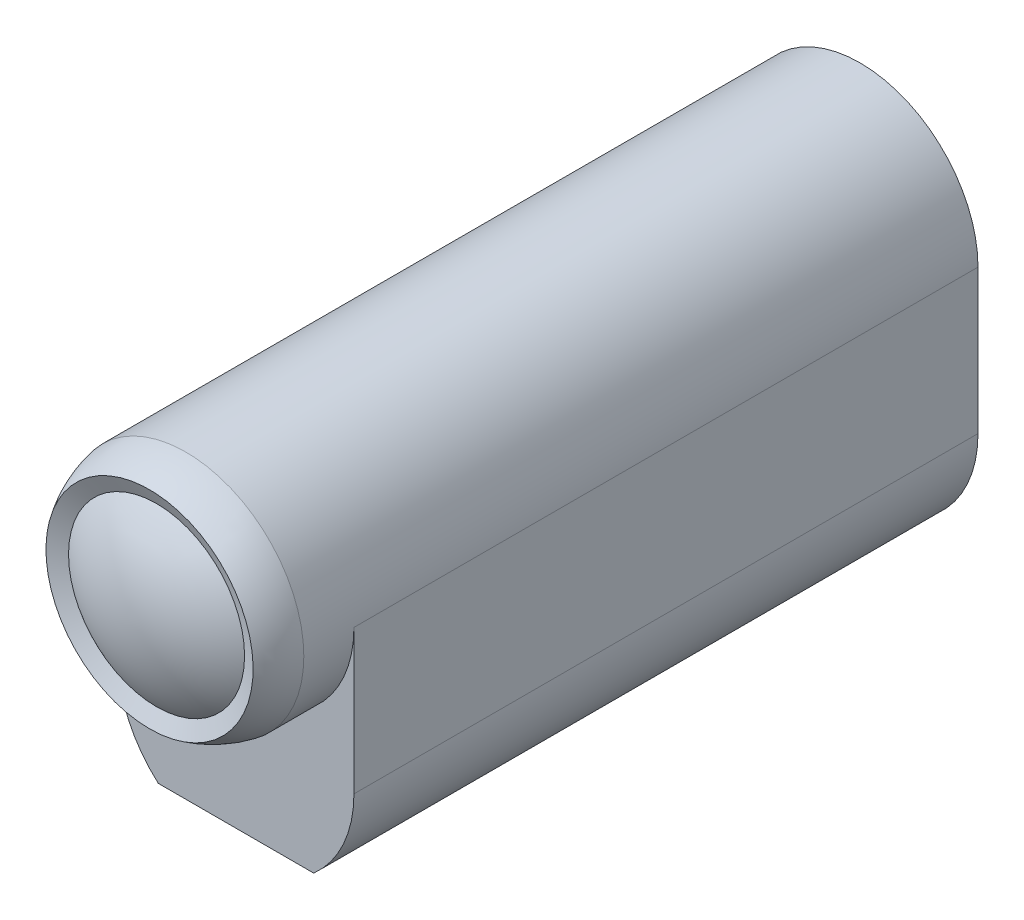
ISO-10303-21;
HEADER;
FILE_DESCRIPTION(('STEP AP214'),'2;1');
FILE_NAME('part.step','',(''),(''),'','','');
FILE_SCHEMA(('AUTOMOTIVE_DESIGN { 1 0 10303 214 1 1 1 1 }'));
ENDSEC;
DATA;
#1=APPLICATION_CONTEXT('core data for automotive mechanical design processes');
#2=APPLICATION_PROTOCOL_DEFINITION('international standard','automotive_design',2000,#1);
#3=PRODUCT_CONTEXT('',#1,'mechanical');
#4=PRODUCT('Part','Part','',(#3));
#5=PRODUCT_RELATED_PRODUCT_CATEGORY('part','',(#4));
#6=PRODUCT_DEFINITION_FORMATION('','',#4);
#7=PRODUCT_DEFINITION_CONTEXT('part definition',#1,'design');
#8=PRODUCT_DEFINITION('design','',#6,#7);
#9=PRODUCT_DEFINITION_SHAPE('','',#8);
#10=(LENGTH_UNIT() NAMED_UNIT(*) SI_UNIT(.MILLI.,.METRE.));
#11=(NAMED_UNIT(*) PLANE_ANGLE_UNIT() SI_UNIT($,.RADIAN.));
#12=(NAMED_UNIT(*) SI_UNIT($,.STERADIAN.) SOLID_ANGLE_UNIT());
#13=UNCERTAINTY_MEASURE_WITH_UNIT(LENGTH_MEASURE(1.E-05),#10,'distance_accuracy_value','');
#14=(GEOMETRIC_REPRESENTATION_CONTEXT(3) GLOBAL_UNCERTAINTY_ASSIGNED_CONTEXT((#13)) GLOBAL_UNIT_ASSIGNED_CONTEXT((#10,
#11,#12)) REPRESENTATION_CONTEXT('',''));
#15=CARTESIAN_POINT('',(0.,0.,0.));
#16=DIRECTION('',(0.,0.,1.));
#17=DIRECTION('',(1.,0.,0.));
#18=AXIS2_PLACEMENT_3D('',#15,#16,#17);
#19=CARTESIAN_POINT('',(0.,-14.6119462428468,63.246));
#20=DIRECTION('',(0.,0.,-1.));
#21=DIRECTION('',(-1.,0.,0.));
#22=AXIS2_PLACEMENT_3D('',#19,#20,#21);
#23=CYLINDRICAL_SURFACE('',#22,11.953875);
#24=CARTESIAN_POINT('',(0.,-14.6119462428468,0.));
#25=DIRECTION('',(0.,0.,1.));
#26=DIRECTION('',(1.,0.,0.));
#27=AXIS2_PLACEMENT_3D('',#24,#25,#26);
#28=CIRCLE('',#27,11.953875);
#29=CARTESIAN_POINT('',(-11.953875,-14.6119462428469,0.));
#30=VERTEX_POINT('',#29);
#31=CARTESIAN_POINT('',(-7.874,-23.606125,0.));
#32=VERTEX_POINT('',#31);
#33=EDGE_CURVE('E123',#30,#32,#28,.T.);
#34=ORIENTED_EDGE('',*,*,#33,.T.);
#35=DIRECTION('',(0.,0.,-1.));
#36=VECTOR('',#35,1.);
#37=CARTESIAN_POINT('',(-7.874,-23.606125,63.246));
#38=LINE('',#37,#36);
#39=CARTESIAN_POINT('',(-7.874,-23.606125,63.246));
#40=VERTEX_POINT('',#39);
#41=EDGE_CURVE('E39',#40,#32,#38,.T.);
#42=ORIENTED_EDGE('',*,*,#41,.F.);
#43=CARTESIAN_POINT('',(0.,-14.6119462428468,63.246));
#44=DIRECTION('',(0.,0.,1.));
#45=DIRECTION('',(1.,0.,0.));
#46=AXIS2_PLACEMENT_3D('',#43,#44,#45);
#47=CIRCLE('',#46,11.953875);
#48=CARTESIAN_POINT('',(-11.953875,-14.6119462428469,63.246));
#49=VERTEX_POINT('',#48);
#50=EDGE_CURVE('E134',#49,#40,#47,.T.);
#51=ORIENTED_EDGE('',*,*,#50,.F.);
#52=DIRECTION('',(0.,0.,-1.));
#53=VECTOR('',#52,1.);
#54=CARTESIAN_POINT('',(-11.953875,-14.6119462428469,63.246));
#55=LINE('',#54,#53);
#56=EDGE_CURVE('E119',#49,#30,#55,.T.);
#57=ORIENTED_EDGE('',*,*,#56,.T.);
#58=EDGE_LOOP('',(#34,#42,#51,#57));
#59=FACE_BOUND('',#58,.T.);
#60=ADVANCED_FACE('F36',(#59),#23,.T.);
#61=CARTESIAN_POINT('',(-7.874,-23.606125,63.246));
#62=DIRECTION('',(0.,1.,0.));
#63=DIRECTION('',(0.,0.,1.));
#64=AXIS2_PLACEMENT_3D('',#61,#62,#63);
#65=PLANE('',#64);
#66=DIRECTION('',(1.,0.,0.));
#67=VECTOR('',#66,1.);
#68=CARTESIAN_POINT('',(-7.874,-23.606125,0.));
#69=LINE('',#68,#67);
#70=CARTESIAN_POINT('',(7.874,-23.606125,0.));
#71=VERTEX_POINT('',#70);
#72=EDGE_CURVE('E126',#32,#71,#69,.T.);
#73=ORIENTED_EDGE('',*,*,#72,.T.);
#74=DIRECTION('',(0.,0.,-1.));
#75=VECTOR('',#74,1.);
#76=CARTESIAN_POINT('',(7.874,-23.606125,63.246));
#77=LINE('',#76,#75);
#78=CARTESIAN_POINT('',(7.874,-23.606125,63.246));
#79=VERTEX_POINT('',#78);
#80=EDGE_CURVE('E113',#79,#71,#77,.T.);
#81=ORIENTED_EDGE('',*,*,#80,.F.);
#82=DIRECTION('',(1.,0.,0.));
#83=VECTOR('',#82,1.);
#84=CARTESIAN_POINT('',(-7.874,-23.606125,63.246));
#85=LINE('',#84,#83);
#86=EDGE_CURVE('E92',#40,#79,#85,.T.);
#87=ORIENTED_EDGE('',*,*,#86,.F.);
#88=ORIENTED_EDGE('',*,*,#41,.T.);
#89=EDGE_LOOP('',(#73,#81,#87,#88));
#90=FACE_BOUND('',#89,.T.);
#91=ADVANCED_FACE('F139',(#90),#65,.F.);
#92=CARTESIAN_POINT('',(0.,-14.6119462428468,63.246));
#93=DIRECTION('',(0.,0.,-1.));
#94=DIRECTION('',(-1.,0.,0.));
#95=AXIS2_PLACEMENT_3D('',#92,#93,#94);
#96=CYLINDRICAL_SURFACE('',#95,11.953875);
#97=CARTESIAN_POINT('',(0.,-14.6119462428468,0.));
#98=DIRECTION('',(0.,0.,1.));
#99=DIRECTION('',(1.,0.,0.));
#100=AXIS2_PLACEMENT_3D('',#97,#98,#99);
#101=CIRCLE('',#100,11.953875);
#102=CARTESIAN_POINT('',(11.953875,-14.6119462428468,0.));
#103=VERTEX_POINT('',#102);
#104=EDGE_CURVE('E110',#71,#103,#101,.T.);
#105=ORIENTED_EDGE('',*,*,#104,.T.);
#106=DIRECTION('',(0.,0.,-1.));
#107=VECTOR('',#106,1.);
#108=CARTESIAN_POINT('',(11.953875,-14.6119462428468,63.246));
#109=LINE('',#108,#107);
#110=CARTESIAN_POINT('',(11.953875,-14.6119462428468,63.246));
#111=VERTEX_POINT('',#110);
#112=EDGE_CURVE('E107',#111,#103,#109,.T.);
#113=ORIENTED_EDGE('',*,*,#112,.F.);
#114=CARTESIAN_POINT('',(0.,-14.6119462428468,63.246));
#115=DIRECTION('',(0.,0.,1.));
#116=DIRECTION('',(1.,0.,0.));
#117=AXIS2_PLACEMENT_3D('',#114,#115,#116);
#118=CIRCLE('',#117,11.953875);
#119=EDGE_CURVE('E98',#79,#111,#118,.T.);
#120=ORIENTED_EDGE('',*,*,#119,.F.);
#121=ORIENTED_EDGE('',*,*,#80,.T.);
#122=EDGE_LOOP('',(#105,#113,#120,#121));
#123=FACE_BOUND('',#122,.T.);
#124=ADVANCED_FACE('F108',(#123),#96,.T.);
#125=CARTESIAN_POINT('',(11.953875,0.,63.246));
#126=DIRECTION('',(-1.,0.,0.));
#127=DIRECTION('',(0.,-1.,0.));
#128=AXIS2_PLACEMENT_3D('',#125,#126,#127);
#129=PLANE('',#128);
#130=DIRECTION('',(0.,1.,0.));
#131=VECTOR('',#130,1.);
#132=CARTESIAN_POINT('',(11.953875,0.,0.));
#133=LINE('',#132,#131);
#134=CARTESIAN_POINT('',(11.953875,0.,0.));
#135=VERTEX_POINT('',#134);
#136=EDGE_CURVE('E130',#103,#135,#133,.T.);
#137=ORIENTED_EDGE('',*,*,#136,.T.);
#138=DIRECTION('',(0.,0.,-1.));
#139=VECTOR('',#138,1.);
#140=CARTESIAN_POINT('',(11.953875,0.,63.246));
#141=LINE('',#140,#139);
#142=CARTESIAN_POINT('',(11.953875,0.,63.246));
#143=VERTEX_POINT('',#142);
#144=EDGE_CURVE('E114',#143,#135,#141,.T.);
#145=ORIENTED_EDGE('',*,*,#144,.F.);
#146=DIRECTION('',(0.,1.,0.));
#147=VECTOR('',#146,1.);
#148=CARTESIAN_POINT('',(11.953875,0.,63.246));
#149=LINE('',#148,#147);
#150=EDGE_CURVE('E102',#111,#143,#149,.T.);
#151=ORIENTED_EDGE('',*,*,#150,.F.);
#152=ORIENTED_EDGE('',*,*,#112,.T.);
#153=EDGE_LOOP('',(#137,#145,#151,#152));
#154=FACE_BOUND('',#153,.T.);
#155=ADVANCED_FACE('F117',(#154),#129,.F.);
#156=CARTESIAN_POINT('',(0.,0.,63.246));
#157=DIRECTION('',(0.,0.,-1.));
#158=DIRECTION('',(-1.,0.,0.));
#159=AXIS2_PLACEMENT_3D('',#156,#157,#158);
#160=CYLINDRICAL_SURFACE('',#159,11.953875);
#161=CARTESIAN_POINT('',(0.,0.,0.));
#162=DIRECTION('',(0.,0.,1.));
#163=DIRECTION('',(1.,0.,0.));
#164=AXIS2_PLACEMENT_3D('',#161,#162,#163);
#165=CIRCLE('',#164,11.953875);
#166=CARTESIAN_POINT('',(-11.953875,0.,0.));
#167=VERTEX_POINT('',#166);
#168=EDGE_CURVE('E77',#135,#167,#165,.T.);
#169=ORIENTED_EDGE('',*,*,#168,.T.);
#170=DIRECTION('',(0.,0.,-1.));
#171=VECTOR('',#170,1.);
#172=CARTESIAN_POINT('',(-11.953875,0.,63.246));
#173=LINE('',#172,#171);
#174=CARTESIAN_POINT('',(-11.953875,0.,63.246));
#175=VERTEX_POINT('',#174);
#176=EDGE_CURVE('E136',#175,#167,#173,.T.);
#177=ORIENTED_EDGE('',*,*,#176,.F.);
#178=CARTESIAN_POINT('',(0.,0.,63.246));
#179=DIRECTION('',(0.,0.,1.));
#180=DIRECTION('',(1.,0.,0.));
#181=AXIS2_PLACEMENT_3D('',#178,#179,#180);
#182=CIRCLE('',#181,11.953875);
#183=EDGE_CURVE('E11',#175,#143,#182,.T.);
#184=ORIENTED_EDGE('',*,*,#183,.T.);
#185=ORIENTED_EDGE('',*,*,#144,.T.);
#186=EDGE_LOOP('',(#169,#177,#184,#185));
#187=FACE_BOUND('',#186,.T.);
#188=CARTESIAN_POINT('',(0.,0.,68.326));
#189=DIRECTION('',(0.,0.,1.));
#190=DIRECTION('',(1.,0.,0.));
#191=AXIS2_PLACEMENT_3D('',#188,#189,#190);
#192=CIRCLE('',#191,11.953875);
#193=CARTESIAN_POINT('',(11.953875,0.,68.326));
#194=VERTEX_POINT('',#193);
#195=EDGE_CURVE('E127',#194,#194,#192,.T.);
#196=ORIENTED_EDGE('',*,*,#195,.F.);
#197=EDGE_LOOP('',(#196));
#198=FACE_BOUND('',#197,.T.);
#199=ADVANCED_FACE('F145',(#187,#198),#160,.T.);
#200=CARTESIAN_POINT('',(-11.953875,0.,63.246));
#201=DIRECTION('',(1.,0.,0.));
#202=DIRECTION('',(0.,1.,0.));
#203=AXIS2_PLACEMENT_3D('',#200,#201,#202);
#204=PLANE('',#203);
#205=DIRECTION('',(0.,-1.,0.));
#206=VECTOR('',#205,1.);
#207=CARTESIAN_POINT('',(-11.953875,0.,0.));
#208=LINE('',#207,#206);
#209=EDGE_CURVE('E83',#167,#30,#208,.T.);
#210=ORIENTED_EDGE('',*,*,#209,.T.);
#211=ORIENTED_EDGE('',*,*,#56,.F.);
#212=DIRECTION('',(0.,-1.,0.));
#213=VECTOR('',#212,1.);
#214=CARTESIAN_POINT('',(-11.953875,0.,63.246));
#215=LINE('',#214,#213);
#216=EDGE_CURVE('E53',#175,#49,#215,.T.);
#217=ORIENTED_EDGE('',*,*,#216,.F.);
#218=ORIENTED_EDGE('',*,*,#176,.T.);
#219=EDGE_LOOP('',(#210,#211,#217,#218));
#220=FACE_BOUND('',#219,.T.);
#221=ADVANCED_FACE('F147',(#220),#204,.F.);
#222=CARTESIAN_POINT('',(0.,-14.6119462428468,63.246));
#223=DIRECTION('',(0.,0.,1.));
#224=DIRECTION('',(1.,0.,0.));
#225=AXIS2_PLACEMENT_3D('',#222,#223,#224);
#226=PLANE('',#225);
#227=ORIENTED_EDGE('',*,*,#183,.F.);
#228=ORIENTED_EDGE('',*,*,#216,.T.);
#229=ORIENTED_EDGE('',*,*,#50,.T.);
#230=ORIENTED_EDGE('',*,*,#86,.T.);
#231=ORIENTED_EDGE('',*,*,#119,.T.);
#232=ORIENTED_EDGE('',*,*,#150,.T.);
#233=EDGE_LOOP('',(#227,#228,#229,#230,#231,#232));
#234=FACE_BOUND('',#233,.T.);
#235=ADVANCED_FACE('F100',(#234),#226,.T.);
#236=CARTESIAN_POINT('',(0.,-14.6119462428468,0.));
#237=DIRECTION('',(0.,0.,1.));
#238=DIRECTION('',(1.,0.,0.));
#239=AXIS2_PLACEMENT_3D('',#236,#237,#238);
#240=PLANE('',#239);
#241=ORIENTED_EDGE('',*,*,#33,.F.);
#242=ORIENTED_EDGE('',*,*,#209,.F.);
#243=ORIENTED_EDGE('',*,*,#168,.F.);
#244=ORIENTED_EDGE('',*,*,#136,.F.);
#245=ORIENTED_EDGE('',*,*,#104,.F.);
#246=ORIENTED_EDGE('',*,*,#72,.F.);
#247=EDGE_LOOP('',(#241,#242,#243,#244,#245,#246));
#248=FACE_BOUND('',#247,.T.);
#249=ADVANCED_FACE('F144',(#248),#240,.F.);
#250=CARTESIAN_POINT('',(0.,0.,66.6624388234664));
#251=DIRECTION('',(0.,0.,1.));
#252=DIRECTION('',(0.,-1.,0.));
#253=AXIS2_PLACEMENT_3D('',#250,#251,#252);
#254=DEGENERATE_TOROIDAL_SURFACE('',#253,2.36103830649338,9.73601312737184,.T.);
#255=CARTESIAN_POINT('',(0.,0.,72.009));
#256=DIRECTION('',(0.,0.,1.));
#257=DIRECTION('',(0.,-1.,0.));
#258=AXIS2_PLACEMENT_3D('',#255,#256,#257);
#259=CIRCLE('',#258,10.4976368096727);
#260=CARTESIAN_POINT('',(0.,-10.4976368096727,72.009));
#261=VERTEX_POINT('',#260);
#262=EDGE_CURVE('E152',#261,#261,#259,.T.);
#263=ORIENTED_EDGE('',*,*,#262,.F.);
#264=EDGE_LOOP('',(#263));
#265=FACE_BOUND('',#264,.T.);
#266=ORIENTED_EDGE('',*,*,#195,.T.);
#267=EDGE_LOOP('',(#266));
#268=FACE_BOUND('',#267,.T.);
#269=ADVANCED_FACE('F164',(#265,#268),#254,.T.);
#270=CARTESIAN_POINT('',(0.,0.,72.009));
#271=DIRECTION('',(0.,0.,1.));
#272=DIRECTION('',(0.,-1.,0.));
#273=AXIS2_PLACEMENT_3D('',#270,#271,#272);
#274=CONICAL_SURFACE('',#273,10.4976368096727,1.14695557854824);
#275=CARTESIAN_POINT('',(0.,0.,71.2978));
#276=DIRECTION('',(0.,0.,1.));
#277=DIRECTION('',(0.,-1.,0.));
#278=AXIS2_PLACEMENT_3D('',#275,#276,#277);
#279=CIRCLE('',#278,8.92135089180158);
#280=CARTESIAN_POINT('',(0.,-8.92135089180158,71.2978));
#281=VERTEX_POINT('',#280);
#282=EDGE_CURVE('E155',#281,#281,#279,.T.);
#283=ORIENTED_EDGE('',*,*,#282,.F.);
#284=EDGE_LOOP('',(#283));
#285=FACE_BOUND('',#284,.T.);
#286=ORIENTED_EDGE('',*,*,#262,.T.);
#287=EDGE_LOOP('',(#286));
#288=FACE_BOUND('',#287,.T.);
#289=ADVANCED_FACE('F161',(#285,#288),#274,.F.);
#290=CARTESIAN_POINT('',(0.,0.,59.3927413664027));
#291=DIRECTION('',(0.,0.,1.));
#292=DIRECTION('',(0.,1.,0.));
#293=AXIS2_PLACEMENT_3D('',#290,#291,#292);
#294=SPHERICAL_SURFACE('',#293,14.8768586335973);
#295=ORIENTED_EDGE('',*,*,#282,.T.);
#296=EDGE_LOOP('',(#295));
#297=FACE_BOUND('',#296,.T.);
#298=ADVANCED_FACE('F159',(#297),#294,.T.);
#299=CLOSED_SHELL('',(#60,#91,#124,#155,#199,#221,#235,#249,#269,#289,#298));
#300=MANIFOLD_SOLID_BREP('B2',#299);
#301=ADVANCED_BREP_SHAPE_REPRESENTATION('',(#18,#300),#14);
#302=SHAPE_DEFINITION_REPRESENTATION(#9,#301);
ENDSEC;
END-ISO-10303-21;
